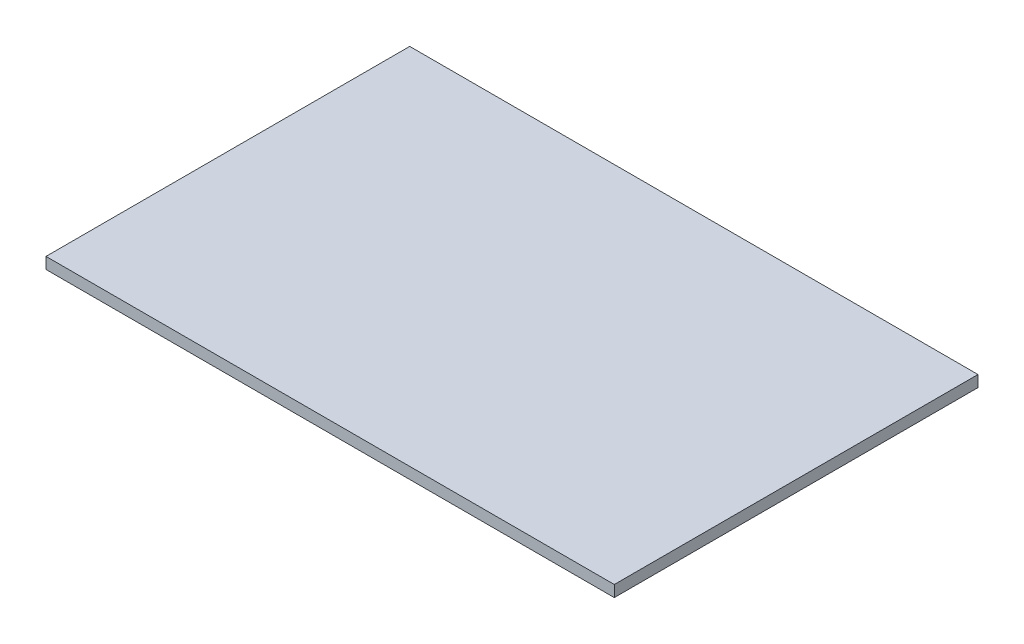
ISO-10303-21;
HEADER;
FILE_DESCRIPTION(('STEP AP214'),'2;1');
FILE_NAME('part.step','',(''),(''),'','','');
FILE_SCHEMA(('AUTOMOTIVE_DESIGN { 1 0 10303 214 1 1 1 1 }'));
ENDSEC;
DATA;
#1=APPLICATION_CONTEXT('core data for automotive mechanical design processes');
#2=APPLICATION_PROTOCOL_DEFINITION('international standard','automotive_design',2000,#1);
#3=PRODUCT_CONTEXT('',#1,'mechanical');
#4=PRODUCT('Part','Part','',(#3));
#5=PRODUCT_RELATED_PRODUCT_CATEGORY('part','',(#4));
#6=PRODUCT_DEFINITION_FORMATION('','',#4);
#7=PRODUCT_DEFINITION_CONTEXT('part definition',#1,'design');
#8=PRODUCT_DEFINITION('design','',#6,#7);
#9=PRODUCT_DEFINITION_SHAPE('','',#8);
#10=(LENGTH_UNIT() NAMED_UNIT(*) SI_UNIT(.MILLI.,.METRE.));
#11=(NAMED_UNIT(*) PLANE_ANGLE_UNIT() SI_UNIT($,.RADIAN.));
#12=(NAMED_UNIT(*) SI_UNIT($,.STERADIAN.) SOLID_ANGLE_UNIT());
#13=UNCERTAINTY_MEASURE_WITH_UNIT(LENGTH_MEASURE(1.E-05),#10,'distance_accuracy_value','');
#14=(GEOMETRIC_REPRESENTATION_CONTEXT(3) GLOBAL_UNCERTAINTY_ASSIGNED_CONTEXT((#13)) GLOBAL_UNIT_ASSIGNED_CONTEXT((#10,
#11,#12)) REPRESENTATION_CONTEXT('',''));
#15=CARTESIAN_POINT('',(0.,0.,0.));
#16=DIRECTION('',(0.,0.,1.));
#17=DIRECTION('',(1.,0.,0.));
#18=AXIS2_PLACEMENT_3D('',#15,#16,#17);
#19=CARTESIAN_POINT('',(79.375,3.175,50.8));
#20=DIRECTION('',(-1.,0.,0.));
#21=DIRECTION('',(0.,0.,1.));
#22=AXIS2_PLACEMENT_3D('',#19,#20,#21);
#23=PLANE('',#22);
#24=DIRECTION('',(0.,0.,-1.));
#25=VECTOR('',#24,1.);
#26=CARTESIAN_POINT('',(79.375,0.,50.8));
#27=LINE('',#26,#25);
#28=CARTESIAN_POINT('',(79.375,0.,50.8));
#29=VERTEX_POINT('',#28);
#30=CARTESIAN_POINT('',(79.375,0.,-50.8));
#31=VERTEX_POINT('',#30);
#32=EDGE_CURVE('E96',#29,#31,#27,.T.);
#33=ORIENTED_EDGE('',*,*,#32,.T.);
#34=DIRECTION('',(0.,-1.,0.));
#35=VECTOR('',#34,1.);
#36=CARTESIAN_POINT('',(79.375,3.175,-50.8));
#37=LINE('',#36,#35);
#38=CARTESIAN_POINT('',(79.375,3.175,-50.8));
#39=VERTEX_POINT('',#38);
#40=EDGE_CURVE('E11',#39,#31,#37,.T.);
#41=ORIENTED_EDGE('',*,*,#40,.F.);
#42=DIRECTION('',(0.,0.,-1.));
#43=VECTOR('',#42,1.);
#44=CARTESIAN_POINT('',(79.375,3.175,50.8));
#45=LINE('',#44,#43);
#46=CARTESIAN_POINT('',(79.375,3.175,50.8));
#47=VERTEX_POINT('',#46);
#48=EDGE_CURVE('E84',#47,#39,#45,.T.);
#49=ORIENTED_EDGE('',*,*,#48,.F.);
#50=DIRECTION('',(0.,-1.,0.));
#51=VECTOR('',#50,1.);
#52=CARTESIAN_POINT('',(79.375,3.175,50.8));
#53=LINE('',#52,#51);
#54=EDGE_CURVE('E92',#47,#29,#53,.T.);
#55=ORIENTED_EDGE('',*,*,#54,.T.);
#56=EDGE_LOOP('',(#33,#41,#49,#55));
#57=FACE_BOUND('',#56,.T.);
#58=ADVANCED_FACE('F33',(#57),#23,.F.);
#59=CARTESIAN_POINT('',(-79.375,3.175,-50.8));
#60=DIRECTION('',(0.,0.,1.));
#61=DIRECTION('',(1.,0.,0.));
#62=AXIS2_PLACEMENT_3D('',#59,#60,#61);
#63=PLANE('',#62);
#64=DIRECTION('',(-1.,0.,0.));
#65=VECTOR('',#64,1.);
#66=CARTESIAN_POINT('',(-79.375,0.,-50.8));
#67=LINE('',#66,#65);
#68=CARTESIAN_POINT('',(-79.375,0.,-50.8));
#69=VERTEX_POINT('',#68);
#70=EDGE_CURVE('E88',#31,#69,#67,.T.);
#71=ORIENTED_EDGE('',*,*,#70,.T.);
#72=DIRECTION('',(0.,-1.,0.));
#73=VECTOR('',#72,1.);
#74=CARTESIAN_POINT('',(-79.375,3.175,-50.8));
#75=LINE('',#74,#73);
#76=CARTESIAN_POINT('',(-79.375,3.175,-50.8));
#77=VERTEX_POINT('',#76);
#78=EDGE_CURVE('E41',#77,#69,#75,.T.);
#79=ORIENTED_EDGE('',*,*,#78,.F.);
#80=DIRECTION('',(-1.,0.,0.));
#81=VECTOR('',#80,1.);
#82=CARTESIAN_POINT('',(-79.375,3.175,-50.8));
#83=LINE('',#82,#81);
#84=EDGE_CURVE('E79',#39,#77,#83,.T.);
#85=ORIENTED_EDGE('',*,*,#84,.F.);
#86=ORIENTED_EDGE('',*,*,#40,.T.);
#87=EDGE_LOOP('',(#71,#79,#85,#86));
#88=FACE_BOUND('',#87,.T.);
#89=ADVANCED_FACE('F87',(#88),#63,.F.);
#90=CARTESIAN_POINT('',(-79.375,3.175,50.8));
#91=DIRECTION('',(1.,0.,0.));
#92=DIRECTION('',(0.,0.,-1.));
#93=AXIS2_PLACEMENT_3D('',#90,#91,#92);
#94=PLANE('',#93);
#95=DIRECTION('',(0.,0.,1.));
#96=VECTOR('',#95,1.);
#97=CARTESIAN_POINT('',(-79.375,0.,50.8));
#98=LINE('',#97,#96);
#99=CARTESIAN_POINT('',(-79.375,0.,50.8));
#100=VERTEX_POINT('',#99);
#101=EDGE_CURVE('E66',#69,#100,#98,.T.);
#102=ORIENTED_EDGE('',*,*,#101,.T.);
#103=DIRECTION('',(0.,-1.,0.));
#104=VECTOR('',#103,1.);
#105=CARTESIAN_POINT('',(-79.375,3.175,50.8));
#106=LINE('',#105,#104);
#107=CARTESIAN_POINT('',(-79.375,3.175,50.8));
#108=VERTEX_POINT('',#107);
#109=EDGE_CURVE('E89',#108,#100,#106,.T.);
#110=ORIENTED_EDGE('',*,*,#109,.F.);
#111=DIRECTION('',(0.,0.,1.));
#112=VECTOR('',#111,1.);
#113=CARTESIAN_POINT('',(-79.375,3.175,50.8));
#114=LINE('',#113,#112);
#115=EDGE_CURVE('E82',#77,#108,#114,.T.);
#116=ORIENTED_EDGE('',*,*,#115,.F.);
#117=ORIENTED_EDGE('',*,*,#78,.T.);
#118=EDGE_LOOP('',(#102,#110,#116,#117));
#119=FACE_BOUND('',#118,.T.);
#120=ADVANCED_FACE('F90',(#119),#94,.F.);
#121=CARTESIAN_POINT('',(-79.375,3.175,50.8));
#122=DIRECTION('',(0.,0.,-1.));
#123=DIRECTION('',(-1.,0.,0.));
#124=AXIS2_PLACEMENT_3D('',#121,#122,#123);
#125=PLANE('',#124);
#126=DIRECTION('',(1.,0.,0.));
#127=VECTOR('',#126,1.);
#128=CARTESIAN_POINT('',(-79.375,0.,50.8));
#129=LINE('',#128,#127);
#130=EDGE_CURVE('E72',#100,#29,#129,.T.);
#131=ORIENTED_EDGE('',*,*,#130,.T.);
#132=ORIENTED_EDGE('',*,*,#54,.F.);
#133=DIRECTION('',(1.,0.,0.));
#134=VECTOR('',#133,1.);
#135=CARTESIAN_POINT('',(-79.375,3.175,50.8));
#136=LINE('',#135,#134);
#137=EDGE_CURVE('E49',#108,#47,#136,.T.);
#138=ORIENTED_EDGE('',*,*,#137,.F.);
#139=ORIENTED_EDGE('',*,*,#109,.T.);
#140=EDGE_LOOP('',(#131,#132,#138,#139));
#141=FACE_BOUND('',#140,.T.);
#142=ADVANCED_FACE('F103',(#141),#125,.F.);
#143=CARTESIAN_POINT('',(0.,3.175,0.));
#144=DIRECTION('',(0.,-1.,0.));
#145=DIRECTION('',(0.,0.,-1.));
#146=AXIS2_PLACEMENT_3D('',#143,#144,#145);
#147=PLANE('',#146);
#148=ORIENTED_EDGE('',*,*,#48,.T.);
#149=ORIENTED_EDGE('',*,*,#84,.T.);
#150=ORIENTED_EDGE('',*,*,#115,.T.);
#151=ORIENTED_EDGE('',*,*,#137,.T.);
#152=EDGE_LOOP('',(#148,#149,#150,#151));
#153=FACE_BOUND('',#152,.T.);
#154=ADVANCED_FACE('F80',(#153),#147,.F.);
#155=CARTESIAN_POINT('',(0.,0.,0.));
#156=DIRECTION('',(0.,-1.,0.));
#157=DIRECTION('',(0.,0.,-1.));
#158=AXIS2_PLACEMENT_3D('',#155,#156,#157);
#159=PLANE('',#158);
#160=ORIENTED_EDGE('',*,*,#32,.F.);
#161=ORIENTED_EDGE('',*,*,#130,.F.);
#162=ORIENTED_EDGE('',*,*,#101,.F.);
#163=ORIENTED_EDGE('',*,*,#70,.F.);
#164=EDGE_LOOP('',(#160,#161,#162,#163));
#165=FACE_BOUND('',#164,.T.);
#166=ADVANCED_FACE('F106',(#165),#159,.T.);
#167=CLOSED_SHELL('',(#58,#89,#120,#142,#154,#166));
#168=MANIFOLD_SOLID_BREP('B2',#167);
#169=ADVANCED_BREP_SHAPE_REPRESENTATION('',(#18,#168),#14);
#170=SHAPE_DEFINITION_REPRESENTATION(#9,#169);
ENDSEC;
END-ISO-10303-21;
